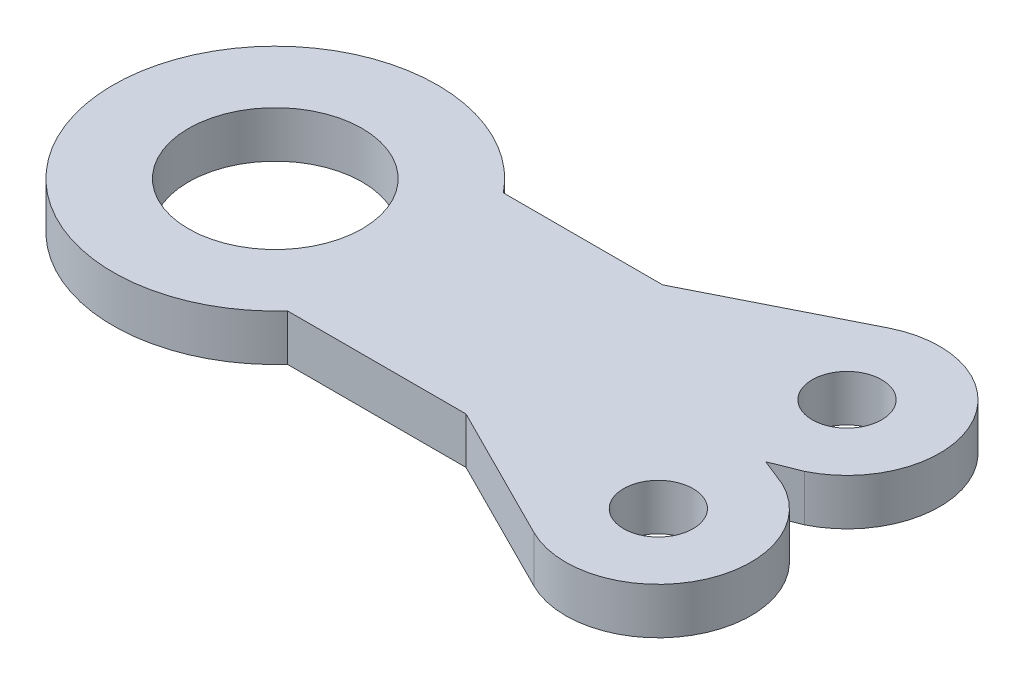
ISO-10303-21;
HEADER;
FILE_DESCRIPTION(('STEP AP214'),'2;1');
FILE_NAME('part.step','',(''),(''),'','','');
FILE_SCHEMA(('AUTOMOTIVE_DESIGN { 1 0 10303 214 1 1 1 1 }'));
ENDSEC;
DATA;
#1=APPLICATION_CONTEXT('core data for automotive mechanical design processes');
#2=APPLICATION_PROTOCOL_DEFINITION('international standard','automotive_design',2000,#1);
#3=PRODUCT_CONTEXT('',#1,'mechanical');
#4=PRODUCT('Part','Part','',(#3));
#5=PRODUCT_RELATED_PRODUCT_CATEGORY('part','',(#4));
#6=PRODUCT_DEFINITION_FORMATION('','',#4);
#7=PRODUCT_DEFINITION_CONTEXT('part definition',#1,'design');
#8=PRODUCT_DEFINITION('design','',#6,#7);
#9=PRODUCT_DEFINITION_SHAPE('','',#8);
#10=(LENGTH_UNIT() NAMED_UNIT(*) SI_UNIT(.MILLI.,.METRE.));
#11=(NAMED_UNIT(*) PLANE_ANGLE_UNIT() SI_UNIT($,.RADIAN.));
#12=(NAMED_UNIT(*) SI_UNIT($,.STERADIAN.) SOLID_ANGLE_UNIT());
#13=UNCERTAINTY_MEASURE_WITH_UNIT(LENGTH_MEASURE(1.E-05),#10,'distance_accuracy_value','');
#14=(GEOMETRIC_REPRESENTATION_CONTEXT(3) GLOBAL_UNCERTAINTY_ASSIGNED_CONTEXT((#13)) GLOBAL_UNIT_ASSIGNED_CONTEXT((#10,
#11,#12)) REPRESENTATION_CONTEXT('',''));
#15=CARTESIAN_POINT('',(0.,0.,0.));
#16=DIRECTION('',(0.,0.,1.));
#17=DIRECTION('',(1.,0.,0.));
#18=AXIS2_PLACEMENT_3D('',#15,#16,#17);
#19=CARTESIAN_POINT('',(0.,2.,0.));
#20=DIRECTION('',(0.,-1.,0.));
#21=DIRECTION('',(0.,0.,-1.));
#22=AXIS2_PLACEMENT_3D('',#19,#20,#21);
#23=CYLINDRICAL_SURFACE('',#22,7.);
#24=DIRECTION('',(0.,1.,0.));
#25=VECTOR('',#24,1.);
#26=CARTESIAN_POINT('',(5.20543287371191,0.,4.68011416498352));
#27=LINE('',#26,#25);
#28=CARTESIAN_POINT('',(5.20543287371191,0.,4.68011416498352));
#29=VERTEX_POINT('',#28);
#30=CARTESIAN_POINT('',(5.20543287371191,2.,4.68011416498352));
#31=VERTEX_POINT('',#30);
#32=EDGE_CURVE('E53',#29,#31,#27,.T.);
#33=ORIENTED_EDGE('',*,*,#32,.T.);
#34=CARTESIAN_POINT('',(0.,2.,0.));
#35=DIRECTION('',(0.,1.,0.));
#36=DIRECTION('',(0.,0.,1.));
#37=AXIS2_PLACEMENT_3D('',#34,#35,#36);
#38=CIRCLE('',#37,7.);
#39=CARTESIAN_POINT('',(5.4539490769416,2.,-4.38798808864927));
#40=VERTEX_POINT('',#39);
#41=EDGE_CURVE('E11',#40,#31,#38,.T.);
#42=ORIENTED_EDGE('',*,*,#41,.F.);
#43=DIRECTION('',(0.,1.,0.));
#44=VECTOR('',#43,1.);
#45=CARTESIAN_POINT('',(5.4539490769416,0.,-4.38798808864927));
#46=LINE('',#45,#44);
#47=CARTESIAN_POINT('',(5.4539490769416,0.,-4.38798808864927));
#48=VERTEX_POINT('',#47);
#49=EDGE_CURVE('E183',#48,#40,#46,.T.);
#50=ORIENTED_EDGE('',*,*,#49,.F.);
#51=CARTESIAN_POINT('',(0.,0.,0.));
#52=DIRECTION('',(0.,1.,0.));
#53=DIRECTION('',(0.,0.,1.));
#54=AXIS2_PLACEMENT_3D('',#51,#52,#53);
#55=CIRCLE('',#54,7.);
#56=EDGE_CURVE('E39',#48,#29,#55,.T.);
#57=ORIENTED_EDGE('',*,*,#56,.T.);
#58=EDGE_LOOP('',(#33,#42,#50,#57));
#59=FACE_BOUND('',#58,.T.);
#60=ADVANCED_FACE('F36',(#59),#23,.T.);
#61=CARTESIAN_POINT('',(0.,2.,0.));
#62=DIRECTION('',(0.,1.,0.));
#63=DIRECTION('',(0.,0.,1.));
#64=AXIS2_PLACEMENT_3D('',#61,#62,#63);
#65=PLANE('',#64);
#66=CARTESIAN_POINT('',(0.,2.,0.));
#67=DIRECTION('',(0.,1.,0.));
#68=DIRECTION('',(0.,0.,1.));
#69=AXIS2_PLACEMENT_3D('',#66,#67,#68);
#70=CIRCLE('',#69,3.75);
#71=CARTESIAN_POINT('',(0.,2.,3.75));
#72=VERTEX_POINT('',#71);
#73=EDGE_CURVE('E179',#72,#72,#70,.T.);
#74=ORIENTED_EDGE('',*,*,#73,.F.);
#75=EDGE_LOOP('',(#74));
#76=FACE_BOUND('',#75,.T.);
#77=ORIENTED_EDGE('',*,*,#41,.T.);
#78=DIRECTION('',(-1.,0.,0.));
#79=VECTOR('',#78,1.);
#80=CARTESIAN_POINT('',(0.,2.,4.68011416498352));
#81=LINE('',#80,#79);
#82=CARTESIAN_POINT('',(12.9098056028276,2.,4.68011416498352));
#83=VERTEX_POINT('',#82);
#84=EDGE_CURVE('E170',#83,#31,#81,.T.);
#85=ORIENTED_EDGE('',*,*,#84,.F.);
#86=DIRECTION('',(0.89337138832784,0.,0.449318998615891));
#87=VECTOR('',#86,1.);
#88=CARTESIAN_POINT('',(0.727690466956486,2.,-1.44685144572219));
#89=LINE('',#88,#87);
#90=CARTESIAN_POINT('',(18.8027240055364,2.,7.64394335206583));
#91=VERTEX_POINT('',#90);
#92=EDGE_CURVE('E173',#83,#91,#89,.T.);
#93=ORIENTED_EDGE('',*,*,#92,.T.);
#94=CARTESIAN_POINT('',(20.6,2.,4.07045779875447));
#95=DIRECTION('',(0.,1.,0.));
#96=DIRECTION('',(0.,0.,1.));
#97=AXIS2_PLACEMENT_3D('',#94,#95,#96);
#98=CIRCLE('',#97,4.);
#99=CARTESIAN_POINT('',(22.356172256262,2.,0.476593721422737));
#100=VERTEX_POINT('',#99);
#101=EDGE_CURVE('E155',#100,#91,#98,.F.);
#102=ORIENTED_EDGE('',*,*,#101,.F.);
#103=DIRECTION('',(0.928503227242699,0.,0.371324328586068));
#104=VECTOR('',#103,1.);
#105=CARTESIAN_POINT('',(2.91819031106072,2.,-7.29698786999951));
#106=LINE('',#105,#104);
#107=CARTESIAN_POINT('',(21.164441000436,2.,0.));
#108=VERTEX_POINT('',#107);
#109=EDGE_CURVE('E120',#108,#100,#106,.T.);
#110=ORIENTED_EDGE('',*,*,#109,.F.);
#111=DIRECTION('',(0.928503227242698,0.,-0.371324328586069));
#112=VECTOR('',#111,1.);
#113=CARTESIAN_POINT('',(2.91819031106074,2.,7.29698786999954));
#114=LINE('',#113,#112);
#115=CARTESIAN_POINT('',(22.3561722562621,2.,-0.476593721422752));
#116=VERTEX_POINT('',#115);
#117=EDGE_CURVE('E158',#108,#116,#114,.T.);
#118=ORIENTED_EDGE('',*,*,#117,.T.);
#119=CARTESIAN_POINT('',(20.6,2.,-4.07045779875447));
#120=DIRECTION('',(0.,1.,0.));
#121=DIRECTION('',(0.,0.,1.));
#122=AXIS2_PLACEMENT_3D('',#119,#120,#121);
#123=CIRCLE('',#122,4.);
#124=CARTESIAN_POINT('',(18.8027240055364,2.,-7.64394335206583));
#125=VERTEX_POINT('',#124);
#126=EDGE_CURVE('E161',#116,#125,#123,.T.);
#127=ORIENTED_EDGE('',*,*,#126,.T.);
#128=DIRECTION('',(0.89337138832784,0.,-0.449318998615891));
#129=VECTOR('',#128,1.);
#130=CARTESIAN_POINT('',(0.727690466956484,2.,1.44685144572219));
#131=LINE('',#130,#129);
#132=CARTESIAN_POINT('',(12.3289775515201,2.,-4.38798808864927));
#133=VERTEX_POINT('',#132);
#134=EDGE_CURVE('E164',#133,#125,#131,.T.);
#135=ORIENTED_EDGE('',*,*,#134,.F.);
#136=DIRECTION('',(-1.,0.,0.));
#137=VECTOR('',#136,1.);
#138=CARTESIAN_POINT('',(0.,2.,-4.38798808864927));
#139=LINE('',#138,#137);
#140=EDGE_CURVE('E167',#133,#40,#139,.T.);
#141=ORIENTED_EDGE('',*,*,#140,.T.);
#142=EDGE_LOOP('',(#77,#85,#93,#102,#110,#118,#127,#135,#141));
#143=FACE_BOUND('',#142,.T.);
#144=CARTESIAN_POINT('',(20.6,2.,4.07045779875447));
#145=DIRECTION('',(0.,1.,0.));
#146=DIRECTION('',(0.,0.,1.));
#147=AXIS2_PLACEMENT_3D('',#144,#145,#146);
#148=CIRCLE('',#147,1.5);
#149=CARTESIAN_POINT('',(20.6,2.,5.57045779875447));
#150=VERTEX_POINT('',#149);
#151=EDGE_CURVE('E133',#150,#150,#148,.T.);
#152=ORIENTED_EDGE('',*,*,#151,.F.);
#153=EDGE_LOOP('',(#152));
#154=FACE_BOUND('',#153,.T.);
#155=CARTESIAN_POINT('',(20.6,2.,-4.07045779875447));
#156=DIRECTION('',(0.,1.,0.));
#157=DIRECTION('',(0.,0.,1.));
#158=AXIS2_PLACEMENT_3D('',#155,#156,#157);
#159=CIRCLE('',#158,1.5);
#160=CARTESIAN_POINT('',(20.6,2.,-2.57045779875447));
#161=VERTEX_POINT('',#160);
#162=EDGE_CURVE('E130',#161,#161,#159,.T.);
#163=ORIENTED_EDGE('',*,*,#162,.F.);
#164=EDGE_LOOP('',(#163));
#165=FACE_BOUND('',#164,.T.);
#166=ADVANCED_FACE('F200',(#76,#143,#154,#165),#65,.T.);
#167=CARTESIAN_POINT('',(0.,0.,0.));
#168=DIRECTION('',(0.,1.,0.));
#169=DIRECTION('',(0.,0.,1.));
#170=AXIS2_PLACEMENT_3D('',#167,#168,#169);
#171=PLANE('',#170);
#172=CARTESIAN_POINT('',(0.,0.,0.));
#173=DIRECTION('',(0.,1.,0.));
#174=DIRECTION('',(0.,0.,1.));
#175=AXIS2_PLACEMENT_3D('',#172,#173,#174);
#176=CIRCLE('',#175,3.75);
#177=CARTESIAN_POINT('',(0.,0.,3.75));
#178=VERTEX_POINT('',#177);
#179=EDGE_CURVE('E192',#178,#178,#176,.T.);
#180=ORIENTED_EDGE('',*,*,#179,.T.);
#181=EDGE_LOOP('',(#180));
#182=FACE_BOUND('',#181,.T.);
#183=ORIENTED_EDGE('',*,*,#56,.F.);
#184=DIRECTION('',(-1.,0.,0.));
#185=VECTOR('',#184,1.);
#186=CARTESIAN_POINT('',(0.,0.,-4.38798808864927));
#187=LINE('',#186,#185);
#188=CARTESIAN_POINT('',(12.3289775515201,0.,-4.38798808864927));
#189=VERTEX_POINT('',#188);
#190=EDGE_CURVE('E142',#189,#48,#187,.T.);
#191=ORIENTED_EDGE('',*,*,#190,.F.);
#192=DIRECTION('',(0.89337138832784,0.,-0.449318998615891));
#193=VECTOR('',#192,1.);
#194=CARTESIAN_POINT('',(0.727690466956484,0.,1.44685144572219));
#195=LINE('',#194,#193);
#196=CARTESIAN_POINT('',(18.8027240055364,0.,-7.64394335206583));
#197=VERTEX_POINT('',#196);
#198=EDGE_CURVE('E140',#189,#197,#195,.T.);
#199=ORIENTED_EDGE('',*,*,#198,.T.);
#200=CARTESIAN_POINT('',(20.6,0.,-4.07045779875447));
#201=DIRECTION('',(0.,1.,0.));
#202=DIRECTION('',(0.,0.,1.));
#203=AXIS2_PLACEMENT_3D('',#200,#201,#202);
#204=CIRCLE('',#203,4.);
#205=CARTESIAN_POINT('',(22.3561722562621,0.,-0.476593721422752));
#206=VERTEX_POINT('',#205);
#207=EDGE_CURVE('E137',#206,#197,#204,.T.);
#208=ORIENTED_EDGE('',*,*,#207,.F.);
#209=DIRECTION('',(0.928503227242698,0.,-0.371324328586069));
#210=VECTOR('',#209,1.);
#211=CARTESIAN_POINT('',(2.91819031106074,0.,7.29698786999954));
#212=LINE('',#211,#210);
#213=CARTESIAN_POINT('',(21.164441000436,0.,0.));
#214=VERTEX_POINT('',#213);
#215=EDGE_CURVE('E113',#214,#206,#212,.T.);
#216=ORIENTED_EDGE('',*,*,#215,.F.);
#217=DIRECTION('',(0.928503227242699,0.,0.371324328586068));
#218=VECTOR('',#217,1.);
#219=CARTESIAN_POINT('',(2.91819031106072,0.,-7.29698786999951));
#220=LINE('',#219,#218);
#221=CARTESIAN_POINT('',(22.356172256262,0.,0.476593721422737));
#222=VERTEX_POINT('',#221);
#223=EDGE_CURVE('E103',#214,#222,#220,.T.);
#224=ORIENTED_EDGE('',*,*,#223,.T.);
#225=CARTESIAN_POINT('',(20.6,0.,4.07045779875447));
#226=DIRECTION('',(0.,1.,0.));
#227=DIRECTION('',(0.,0.,1.));
#228=AXIS2_PLACEMENT_3D('',#225,#226,#227);
#229=CIRCLE('',#228,4.);
#230=CARTESIAN_POINT('',(18.8027240055364,0.,7.64394335206583));
#231=VERTEX_POINT('',#230);
#232=EDGE_CURVE('E109',#222,#231,#229,.F.);
#233=ORIENTED_EDGE('',*,*,#232,.T.);
#234=DIRECTION('',(0.89337138832784,0.,0.449318998615891));
#235=VECTOR('',#234,1.);
#236=CARTESIAN_POINT('',(0.727690466956486,0.,-1.44685144572219));
#237=LINE('',#236,#235);
#238=CARTESIAN_POINT('',(12.9098056028276,0.,4.68011416498352));
#239=VERTEX_POINT('',#238);
#240=EDGE_CURVE('E148',#239,#231,#237,.T.);
#241=ORIENTED_EDGE('',*,*,#240,.F.);
#242=DIRECTION('',(-1.,0.,0.));
#243=VECTOR('',#242,1.);
#244=CARTESIAN_POINT('',(0.,0.,4.68011416498352));
#245=LINE('',#244,#243);
#246=EDGE_CURVE('E145',#239,#29,#245,.T.);
#247=ORIENTED_EDGE('',*,*,#246,.T.);
#248=EDGE_LOOP('',(#183,#191,#199,#208,#216,#224,#233,#241,#247));
#249=FACE_BOUND('',#248,.T.);
#250=CARTESIAN_POINT('',(20.6,0.,4.07045779875447));
#251=DIRECTION('',(0.,1.,0.));
#252=DIRECTION('',(0.,0.,1.));
#253=AXIS2_PLACEMENT_3D('',#250,#251,#252);
#254=CIRCLE('',#253,1.5);
#255=CARTESIAN_POINT('',(20.6,0.,5.57045779875447));
#256=VERTEX_POINT('',#255);
#257=EDGE_CURVE('E150',#256,#256,#254,.T.);
#258=ORIENTED_EDGE('',*,*,#257,.T.);
#259=EDGE_LOOP('',(#258));
#260=FACE_BOUND('',#259,.T.);
#261=CARTESIAN_POINT('',(20.6,0.,-4.07045779875447));
#262=DIRECTION('',(0.,1.,0.));
#263=DIRECTION('',(0.,0.,1.));
#264=AXIS2_PLACEMENT_3D('',#261,#262,#263);
#265=CIRCLE('',#264,1.5);
#266=CARTESIAN_POINT('',(20.6,0.,-2.57045779875447));
#267=VERTEX_POINT('',#266);
#268=EDGE_CURVE('E125',#267,#267,#265,.T.);
#269=ORIENTED_EDGE('',*,*,#268,.T.);
#270=EDGE_LOOP('',(#269));
#271=FACE_BOUND('',#270,.T.);
#272=ADVANCED_FACE('F105',(#182,#249,#260,#271),#171,.F.);
#273=CARTESIAN_POINT('',(0.,0.,0.));
#274=DIRECTION('',(0.,1.,0.));
#275=DIRECTION('',(0.,0.,1.));
#276=AXIS2_PLACEMENT_3D('',#273,#274,#275);
#277=CYLINDRICAL_SURFACE('',#276,3.75);
#278=ORIENTED_EDGE('',*,*,#179,.F.);
#279=EDGE_LOOP('',(#278));
#280=FACE_BOUND('',#279,.T.);
#281=ORIENTED_EDGE('',*,*,#73,.T.);
#282=EDGE_LOOP('',(#281));
#283=FACE_BOUND('',#282,.T.);
#284=ADVANCED_FACE('F198',(#280,#283),#277,.F.);
#285=CARTESIAN_POINT('',(20.6,0.,4.07045779875447));
#286=DIRECTION('',(0.,1.,0.));
#287=DIRECTION('',(0.,0.,1.));
#288=AXIS2_PLACEMENT_3D('',#285,#286,#287);
#289=CYLINDRICAL_SURFACE('',#288,4.);
#290=ORIENTED_EDGE('',*,*,#101,.T.);
#291=DIRECTION('',(0.,1.,0.));
#292=VECTOR('',#291,1.);
#293=CARTESIAN_POINT('',(18.8027240055364,0.,7.64394335206583));
#294=LINE('',#293,#292);
#295=EDGE_CURVE('E128',#231,#91,#294,.T.);
#296=ORIENTED_EDGE('',*,*,#295,.F.);
#297=ORIENTED_EDGE('',*,*,#232,.F.);
#298=DIRECTION('',(0.,1.,0.));
#299=VECTOR('',#298,1.);
#300=CARTESIAN_POINT('',(22.356172256262,0.,0.476593721422737));
#301=LINE('',#300,#299);
#302=EDGE_CURVE('E117',#222,#100,#301,.T.);
#303=ORIENTED_EDGE('',*,*,#302,.T.);
#304=EDGE_LOOP('',(#290,#296,#297,#303));
#305=FACE_BOUND('',#304,.T.);
#306=ADVANCED_FACE('F127',(#305),#289,.T.);
#307=CARTESIAN_POINT('',(0.727690466956486,0.,-1.44685144572219));
#308=DIRECTION('',(-0.449318998615891,0.,0.89337138832784));
#309=DIRECTION('',(0.89337138832784,0.,0.449318998615891));
#310=AXIS2_PLACEMENT_3D('',#307,#308,#309);
#311=PLANE('',#310);
#312=ORIENTED_EDGE('',*,*,#92,.F.);
#313=DIRECTION('',(0.,1.,0.));
#314=VECTOR('',#313,1.);
#315=CARTESIAN_POINT('',(12.9098056028276,0.,4.68011416498352));
#316=LINE('',#315,#314);
#317=EDGE_CURVE('E180',#239,#83,#316,.T.);
#318=ORIENTED_EDGE('',*,*,#317,.F.);
#319=ORIENTED_EDGE('',*,*,#240,.T.);
#320=ORIENTED_EDGE('',*,*,#295,.T.);
#321=EDGE_LOOP('',(#312,#318,#319,#320));
#322=FACE_BOUND('',#321,.T.);
#323=ADVANCED_FACE('F247',(#322),#311,.T.);
#324=CARTESIAN_POINT('',(0.,0.,4.68011416498352));
#325=DIRECTION('',(0.,0.,-1.));
#326=DIRECTION('',(-1.,0.,0.));
#327=AXIS2_PLACEMENT_3D('',#324,#325,#326);
#328=PLANE('',#327);
#329=ORIENTED_EDGE('',*,*,#84,.T.);
#330=ORIENTED_EDGE('',*,*,#32,.F.);
#331=ORIENTED_EDGE('',*,*,#246,.F.);
#332=ORIENTED_EDGE('',*,*,#317,.T.);
#333=EDGE_LOOP('',(#329,#330,#331,#332));
#334=FACE_BOUND('',#333,.T.);
#335=ADVANCED_FACE('F254',(#334),#328,.F.);
#336=CARTESIAN_POINT('',(0.,0.,-4.38798808864927));
#337=DIRECTION('',(0.,0.,-1.));
#338=DIRECTION('',(-1.,0.,0.));
#339=AXIS2_PLACEMENT_3D('',#336,#337,#338);
#340=PLANE('',#339);
#341=ORIENTED_EDGE('',*,*,#140,.F.);
#342=DIRECTION('',(0.,1.,0.));
#343=VECTOR('',#342,1.);
#344=CARTESIAN_POINT('',(12.3289775515201,0.,-4.38798808864927));
#345=LINE('',#344,#343);
#346=EDGE_CURVE('E185',#189,#133,#345,.T.);
#347=ORIENTED_EDGE('',*,*,#346,.F.);
#348=ORIENTED_EDGE('',*,*,#190,.T.);
#349=ORIENTED_EDGE('',*,*,#49,.T.);
#350=EDGE_LOOP('',(#341,#347,#348,#349));
#351=FACE_BOUND('',#350,.T.);
#352=ADVANCED_FACE('F262',(#351),#340,.T.);
#353=CARTESIAN_POINT('',(0.727690466956484,0.,1.44685144572219));
#354=DIRECTION('',(0.449318998615891,0.,0.89337138832784));
#355=DIRECTION('',(0.89337138832784,0.,-0.449318998615891));
#356=AXIS2_PLACEMENT_3D('',#353,#354,#355);
#357=PLANE('',#356);
#358=ORIENTED_EDGE('',*,*,#134,.T.);
#359=DIRECTION('',(0.,1.,0.));
#360=VECTOR('',#359,1.);
#361=CARTESIAN_POINT('',(18.8027240055364,0.,-7.64394335206583));
#362=LINE('',#361,#360);
#363=EDGE_CURVE('E187',#197,#125,#362,.T.);
#364=ORIENTED_EDGE('',*,*,#363,.F.);
#365=ORIENTED_EDGE('',*,*,#198,.F.);
#366=ORIENTED_EDGE('',*,*,#346,.T.);
#367=EDGE_LOOP('',(#358,#364,#365,#366));
#368=FACE_BOUND('',#367,.T.);
#369=ADVANCED_FACE('F270',(#368),#357,.F.);
#370=CARTESIAN_POINT('',(20.6,0.,-4.07045779875447));
#371=DIRECTION('',(0.,1.,0.));
#372=DIRECTION('',(0.,0.,1.));
#373=AXIS2_PLACEMENT_3D('',#370,#371,#372);
#374=CYLINDRICAL_SURFACE('',#373,4.);
#375=ORIENTED_EDGE('',*,*,#126,.F.);
#376=DIRECTION('',(0.,1.,0.));
#377=VECTOR('',#376,1.);
#378=CARTESIAN_POINT('',(22.3561722562621,0.,-0.476593721422752));
#379=LINE('',#378,#377);
#380=EDGE_CURVE('E189',#206,#116,#379,.T.);
#381=ORIENTED_EDGE('',*,*,#380,.F.);
#382=ORIENTED_EDGE('',*,*,#207,.T.);
#383=ORIENTED_EDGE('',*,*,#363,.T.);
#384=EDGE_LOOP('',(#375,#381,#382,#383));
#385=FACE_BOUND('',#384,.T.);
#386=ADVANCED_FACE('F278',(#385),#374,.T.);
#387=CARTESIAN_POINT('',(2.91819031106074,0.,7.29698786999954));
#388=DIRECTION('',(0.371324328586069,0.,0.928503227242698));
#389=DIRECTION('',(0.928503227242698,0.,-0.371324328586069));
#390=AXIS2_PLACEMENT_3D('',#387,#388,#389);
#391=PLANE('',#390);
#392=ORIENTED_EDGE('',*,*,#117,.F.);
#393=DIRECTION('',(0.,1.,0.));
#394=VECTOR('',#393,1.);
#395=CARTESIAN_POINT('',(21.164441000436,0.,0.));
#396=LINE('',#395,#394);
#397=EDGE_CURVE('E124',#214,#108,#396,.T.);
#398=ORIENTED_EDGE('',*,*,#397,.F.);
#399=ORIENTED_EDGE('',*,*,#215,.T.);
#400=ORIENTED_EDGE('',*,*,#380,.T.);
#401=EDGE_LOOP('',(#392,#398,#399,#400));
#402=FACE_BOUND('',#401,.T.);
#403=ADVANCED_FACE('F286',(#402),#391,.T.);
#404=CARTESIAN_POINT('',(20.6,0.,4.07045779875447));
#405=DIRECTION('',(0.,1.,0.));
#406=DIRECTION('',(0.,0.,1.));
#407=AXIS2_PLACEMENT_3D('',#404,#405,#406);
#408=CYLINDRICAL_SURFACE('',#407,1.5);
#409=ORIENTED_EDGE('',*,*,#257,.F.);
#410=EDGE_LOOP('',(#409));
#411=FACE_BOUND('',#410,.T.);
#412=ORIENTED_EDGE('',*,*,#151,.T.);
#413=EDGE_LOOP('',(#412));
#414=FACE_BOUND('',#413,.T.);
#415=ADVANCED_FACE('F217',(#411,#414),#408,.F.);
#416=CARTESIAN_POINT('',(2.91819031106072,0.,-7.29698786999951));
#417=DIRECTION('',(-0.371324328586068,0.,0.928503227242698));
#418=DIRECTION('',(0.928503227242699,0.,0.371324328586068));
#419=AXIS2_PLACEMENT_3D('',#416,#417,#418);
#420=PLANE('',#419);
#421=ORIENTED_EDGE('',*,*,#109,.T.);
#422=ORIENTED_EDGE('',*,*,#302,.F.);
#423=ORIENTED_EDGE('',*,*,#223,.F.);
#424=ORIENTED_EDGE('',*,*,#397,.T.);
#425=EDGE_LOOP('',(#421,#422,#423,#424));
#426=FACE_BOUND('',#425,.T.);
#427=ADVANCED_FACE('F118',(#426),#420,.F.);
#428=CARTESIAN_POINT('',(20.6,0.,-4.07045779875447));
#429=DIRECTION('',(0.,1.,0.));
#430=DIRECTION('',(0.,0.,1.));
#431=AXIS2_PLACEMENT_3D('',#428,#429,#430);
#432=CYLINDRICAL_SURFACE('',#431,1.5);
#433=ORIENTED_EDGE('',*,*,#268,.F.);
#434=EDGE_LOOP('',(#433));
#435=FACE_BOUND('',#434,.T.);
#436=ORIENTED_EDGE('',*,*,#162,.T.);
#437=EDGE_LOOP('',(#436));
#438=FACE_BOUND('',#437,.T.);
#439=ADVANCED_FACE('F210',(#435,#438),#432,.F.);
#440=CLOSED_SHELL('',(#60,#166,#272,#284,#306,#323,#335,#352,#369,#386,#403,#415,#427,#439));
#441=MANIFOLD_SOLID_BREP('B2',#440);
#442=ADVANCED_BREP_SHAPE_REPRESENTATION('',(#18,#441),#14);
#443=SHAPE_DEFINITION_REPRESENTATION(#9,#442);
ENDSEC;
END-ISO-10303-21;
